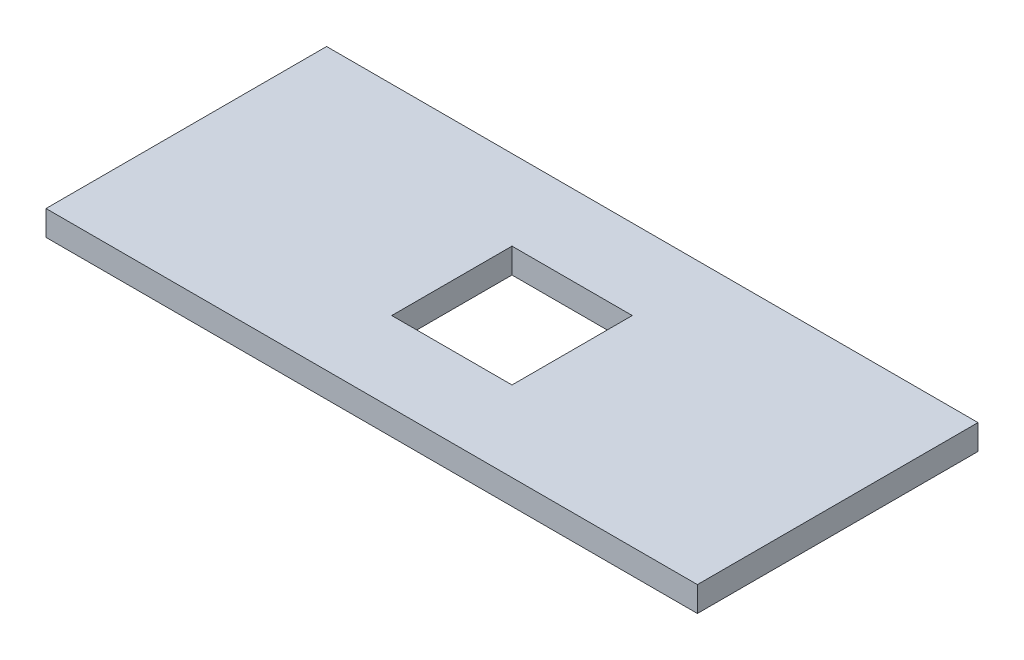
ISO-10303-21;
HEADER;
FILE_DESCRIPTION(('STEP AP214'),'2;1');
FILE_NAME('part.step','',(''),(''),'','','');
FILE_SCHEMA(('AUTOMOTIVE_DESIGN { 1 0 10303 214 1 1 1 1 }'));
ENDSEC;
DATA;
#1=APPLICATION_CONTEXT('core data for automotive mechanical design processes');
#2=APPLICATION_PROTOCOL_DEFINITION('international standard','automotive_design',2000,#1);
#3=PRODUCT_CONTEXT('',#1,'mechanical');
#4=PRODUCT('Part','Part','',(#3));
#5=PRODUCT_RELATED_PRODUCT_CATEGORY('part','',(#4));
#6=PRODUCT_DEFINITION_FORMATION('','',#4);
#7=PRODUCT_DEFINITION_CONTEXT('part definition',#1,'design');
#8=PRODUCT_DEFINITION('design','',#6,#7);
#9=PRODUCT_DEFINITION_SHAPE('','',#8);
#10=(LENGTH_UNIT() NAMED_UNIT(*) SI_UNIT(.MILLI.,.METRE.));
#11=(NAMED_UNIT(*) PLANE_ANGLE_UNIT() SI_UNIT($,.RADIAN.));
#12=(NAMED_UNIT(*) SI_UNIT($,.STERADIAN.) SOLID_ANGLE_UNIT());
#13=UNCERTAINTY_MEASURE_WITH_UNIT(LENGTH_MEASURE(1.E-05),#10,'distance_accuracy_value','');
#14=(GEOMETRIC_REPRESENTATION_CONTEXT(3) GLOBAL_UNCERTAINTY_ASSIGNED_CONTEXT((#13)) GLOBAL_UNIT_ASSIGNED_CONTEXT((#10,
#11,#12)) REPRESENTATION_CONTEXT('',''));
#15=CARTESIAN_POINT('',(0.,0.,0.));
#16=DIRECTION('',(0.,0.,1.));
#17=DIRECTION('',(1.,0.,0.));
#18=AXIS2_PLACEMENT_3D('',#15,#16,#17);
#19=CARTESIAN_POINT('',(0.,5.,0.));
#20=DIRECTION('',(0.,-1.,0.));
#21=DIRECTION('',(0.,0.,-1.));
#22=AXIS2_PLACEMENT_3D('',#19,#20,#21);
#23=PLANE('',#22);
#24=DIRECTION('',(0.,0.,-1.));
#25=VECTOR('',#24,1.);
#26=CARTESIAN_POINT('',(65.,5.,28.));
#27=LINE('',#26,#25);
#28=CARTESIAN_POINT('',(65.,5.,28.));
#29=VERTEX_POINT('',#28);
#30=CARTESIAN_POINT('',(65.,5.,-28.));
#31=VERTEX_POINT('',#30);
#32=EDGE_CURVE('E134',#29,#31,#27,.T.);
#33=ORIENTED_EDGE('',*,*,#32,.T.);
#34=DIRECTION('',(-1.,0.,0.));
#35=VECTOR('',#34,1.);
#36=CARTESIAN_POINT('',(-65.,5.,-28.));
#37=LINE('',#36,#35);
#38=CARTESIAN_POINT('',(-65.,5.,-28.));
#39=VERTEX_POINT('',#38);
#40=EDGE_CURVE('E137',#31,#39,#37,.T.);
#41=ORIENTED_EDGE('',*,*,#40,.T.);
#42=DIRECTION('',(0.,0.,1.));
#43=VECTOR('',#42,1.);
#44=CARTESIAN_POINT('',(-65.,5.,28.));
#45=LINE('',#44,#43);
#46=CARTESIAN_POINT('',(-65.,5.,28.));
#47=VERTEX_POINT('',#46);
#48=EDGE_CURVE('E140',#39,#47,#45,.T.);
#49=ORIENTED_EDGE('',*,*,#48,.T.);
#50=DIRECTION('',(1.,0.,0.));
#51=VECTOR('',#50,1.);
#52=CARTESIAN_POINT('',(-65.,5.,28.));
#53=LINE('',#52,#51);
#54=EDGE_CURVE('E142',#47,#29,#53,.T.);
#55=ORIENTED_EDGE('',*,*,#54,.T.);
#56=EDGE_LOOP('',(#33,#41,#49,#55));
#57=FACE_BOUND('',#56,.T.);
#58=DIRECTION('',(0.,0.,-1.));
#59=VECTOR('',#58,1.);
#60=CARTESIAN_POINT('',(12.,5.,12.));
#61=LINE('',#60,#59);
#62=CARTESIAN_POINT('',(12.,5.,12.));
#63=VERTEX_POINT('',#62);
#64=CARTESIAN_POINT('',(12.,5.,-12.));
#65=VERTEX_POINT('',#64);
#66=EDGE_CURVE('E98',#63,#65,#61,.T.);
#67=ORIENTED_EDGE('',*,*,#66,.F.);
#68=DIRECTION('',(1.,0.,0.));
#69=VECTOR('',#68,1.);
#70=CARTESIAN_POINT('',(-12.,5.,12.));
#71=LINE('',#70,#69);
#72=CARTESIAN_POINT('',(-12.,5.,12.));
#73=VERTEX_POINT('',#72);
#74=EDGE_CURVE('E120',#73,#63,#71,.T.);
#75=ORIENTED_EDGE('',*,*,#74,.F.);
#76=DIRECTION('',(0.,0.,1.));
#77=VECTOR('',#76,1.);
#78=CARTESIAN_POINT('',(-12.,5.,12.));
#79=LINE('',#78,#77);
#80=CARTESIAN_POINT('',(-12.,5.,-12.));
#81=VERTEX_POINT('',#80);
#82=EDGE_CURVE('E118',#81,#73,#79,.T.);
#83=ORIENTED_EDGE('',*,*,#82,.F.);
#84=DIRECTION('',(-1.,0.,0.));
#85=VECTOR('',#84,1.);
#86=CARTESIAN_POINT('',(-12.,5.,-12.));
#87=LINE('',#86,#85);
#88=EDGE_CURVE('E106',#65,#81,#87,.T.);
#89=ORIENTED_EDGE('',*,*,#88,.F.);
#90=EDGE_LOOP('',(#67,#75,#83,#89));
#91=FACE_BOUND('',#90,.T.);
#92=ADVANCED_FACE('F33',(#57,#91),#23,.F.);
#93=CARTESIAN_POINT('',(0.,0.,0.));
#94=DIRECTION('',(0.,-1.,0.));
#95=DIRECTION('',(0.,0.,-1.));
#96=AXIS2_PLACEMENT_3D('',#93,#94,#95);
#97=PLANE('',#96);
#98=DIRECTION('',(0.,0.,-1.));
#99=VECTOR('',#98,1.);
#100=CARTESIAN_POINT('',(65.,0.,28.));
#101=LINE('',#100,#99);
#102=CARTESIAN_POINT('',(65.,0.,28.));
#103=VERTEX_POINT('',#102);
#104=CARTESIAN_POINT('',(65.,0.,-28.));
#105=VERTEX_POINT('',#104);
#106=EDGE_CURVE('E114',#103,#105,#101,.T.);
#107=ORIENTED_EDGE('',*,*,#106,.F.);
#108=DIRECTION('',(1.,0.,0.));
#109=VECTOR('',#108,1.);
#110=CARTESIAN_POINT('',(-65.,0.,28.));
#111=LINE('',#110,#109);
#112=CARTESIAN_POINT('',(-65.,0.,28.));
#113=VERTEX_POINT('',#112);
#114=EDGE_CURVE('E138',#113,#103,#111,.T.);
#115=ORIENTED_EDGE('',*,*,#114,.F.);
#116=DIRECTION('',(0.,0.,1.));
#117=VECTOR('',#116,1.);
#118=CARTESIAN_POINT('',(-65.,0.,28.));
#119=LINE('',#118,#117);
#120=CARTESIAN_POINT('',(-65.,0.,-28.));
#121=VERTEX_POINT('',#120);
#122=EDGE_CURVE('E149',#121,#113,#119,.T.);
#123=ORIENTED_EDGE('',*,*,#122,.F.);
#124=DIRECTION('',(-1.,0.,0.));
#125=VECTOR('',#124,1.);
#126=CARTESIAN_POINT('',(-65.,0.,-28.));
#127=LINE('',#126,#125);
#128=EDGE_CURVE('E147',#105,#121,#127,.T.);
#129=ORIENTED_EDGE('',*,*,#128,.F.);
#130=EDGE_LOOP('',(#107,#115,#123,#129));
#131=FACE_BOUND('',#130,.T.);
#132=DIRECTION('',(1.,0.,0.));
#133=VECTOR('',#132,1.);
#134=CARTESIAN_POINT('',(-12.,0.,12.));
#135=LINE('',#134,#133);
#136=CARTESIAN_POINT('',(-12.,0.,12.));
#137=VERTEX_POINT('',#136);
#138=CARTESIAN_POINT('',(12.,0.,12.));
#139=VERTEX_POINT('',#138);
#140=EDGE_CURVE('E107',#137,#139,#135,.T.);
#141=ORIENTED_EDGE('',*,*,#140,.T.);
#142=DIRECTION('',(0.,0.,-1.));
#143=VECTOR('',#142,1.);
#144=CARTESIAN_POINT('',(12.,0.,12.));
#145=LINE('',#144,#143);
#146=CARTESIAN_POINT('',(12.,0.,-12.));
#147=VERTEX_POINT('',#146);
#148=EDGE_CURVE('E56',#139,#147,#145,.T.);
#149=ORIENTED_EDGE('',*,*,#148,.T.);
#150=DIRECTION('',(-1.,0.,0.));
#151=VECTOR('',#150,1.);
#152=CARTESIAN_POINT('',(-12.,0.,-12.));
#153=LINE('',#152,#151);
#154=CARTESIAN_POINT('',(-12.,0.,-12.));
#155=VERTEX_POINT('',#154);
#156=EDGE_CURVE('E113',#147,#155,#153,.T.);
#157=ORIENTED_EDGE('',*,*,#156,.T.);
#158=DIRECTION('',(0.,0.,1.));
#159=VECTOR('',#158,1.);
#160=CARTESIAN_POINT('',(-12.,0.,12.));
#161=LINE('',#160,#159);
#162=EDGE_CURVE('E126',#155,#137,#161,.T.);
#163=ORIENTED_EDGE('',*,*,#162,.T.);
#164=EDGE_LOOP('',(#141,#149,#157,#163));
#165=FACE_BOUND('',#164,.T.);
#166=ADVANCED_FACE('F167',(#131,#165),#97,.T.);
#167=CARTESIAN_POINT('',(65.,5.,28.));
#168=DIRECTION('',(-1.,0.,0.));
#169=DIRECTION('',(0.,0.,1.));
#170=AXIS2_PLACEMENT_3D('',#167,#168,#169);
#171=PLANE('',#170);
#172=ORIENTED_EDGE('',*,*,#106,.T.);
#173=DIRECTION('',(0.,-1.,0.));
#174=VECTOR('',#173,1.);
#175=CARTESIAN_POINT('',(65.,5.,-28.));
#176=LINE('',#175,#174);
#177=EDGE_CURVE('E11',#31,#105,#176,.T.);
#178=ORIENTED_EDGE('',*,*,#177,.F.);
#179=ORIENTED_EDGE('',*,*,#32,.F.);
#180=DIRECTION('',(0.,-1.,0.));
#181=VECTOR('',#180,1.);
#182=CARTESIAN_POINT('',(65.,5.,28.));
#183=LINE('',#182,#181);
#184=EDGE_CURVE('E144',#29,#103,#183,.T.);
#185=ORIENTED_EDGE('',*,*,#184,.T.);
#186=EDGE_LOOP('',(#172,#178,#179,#185));
#187=FACE_BOUND('',#186,.T.);
#188=ADVANCED_FACE('F35',(#187),#171,.F.);
#189=CARTESIAN_POINT('',(-65.,5.,-28.));
#190=DIRECTION('',(0.,0.,1.));
#191=DIRECTION('',(1.,0.,0.));
#192=AXIS2_PLACEMENT_3D('',#189,#190,#191);
#193=PLANE('',#192);
#194=ORIENTED_EDGE('',*,*,#128,.T.);
#195=DIRECTION('',(0.,-1.,0.));
#196=VECTOR('',#195,1.);
#197=CARTESIAN_POINT('',(-65.,5.,-28.));
#198=LINE('',#197,#196);
#199=EDGE_CURVE('E41',#39,#121,#198,.T.);
#200=ORIENTED_EDGE('',*,*,#199,.F.);
#201=ORIENTED_EDGE('',*,*,#40,.F.);
#202=ORIENTED_EDGE('',*,*,#177,.T.);
#203=EDGE_LOOP('',(#194,#200,#201,#202));
#204=FACE_BOUND('',#203,.T.);
#205=ADVANCED_FACE('F177',(#204),#193,.F.);
#206=CARTESIAN_POINT('',(-65.,5.,28.));
#207=DIRECTION('',(1.,0.,0.));
#208=DIRECTION('',(0.,0.,-1.));
#209=AXIS2_PLACEMENT_3D('',#206,#207,#208);
#210=PLANE('',#209);
#211=ORIENTED_EDGE('',*,*,#122,.T.);
#212=DIRECTION('',(0.,-1.,0.));
#213=VECTOR('',#212,1.);
#214=CARTESIAN_POINT('',(-65.,5.,28.));
#215=LINE('',#214,#213);
#216=EDGE_CURVE('E154',#47,#113,#215,.T.);
#217=ORIENTED_EDGE('',*,*,#216,.F.);
#218=ORIENTED_EDGE('',*,*,#48,.F.);
#219=ORIENTED_EDGE('',*,*,#199,.T.);
#220=EDGE_LOOP('',(#211,#217,#218,#219));
#221=FACE_BOUND('',#220,.T.);
#222=ADVANCED_FACE('F161',(#221),#210,.F.);
#223=CARTESIAN_POINT('',(-65.,5.,28.));
#224=DIRECTION('',(0.,0.,-1.));
#225=DIRECTION('',(-1.,0.,0.));
#226=AXIS2_PLACEMENT_3D('',#223,#224,#225);
#227=PLANE('',#226);
#228=ORIENTED_EDGE('',*,*,#114,.T.);
#229=ORIENTED_EDGE('',*,*,#184,.F.);
#230=ORIENTED_EDGE('',*,*,#54,.F.);
#231=ORIENTED_EDGE('',*,*,#216,.T.);
#232=EDGE_LOOP('',(#228,#229,#230,#231));
#233=FACE_BOUND('',#232,.T.);
#234=ADVANCED_FACE('F171',(#233),#227,.F.);
#235=CARTESIAN_POINT('',(12.,5.,12.));
#236=DIRECTION('',(-1.,0.,0.));
#237=DIRECTION('',(0.,0.,1.));
#238=AXIS2_PLACEMENT_3D('',#235,#236,#237);
#239=PLANE('',#238);
#240=ORIENTED_EDGE('',*,*,#148,.F.);
#241=DIRECTION('',(0.,-1.,0.));
#242=VECTOR('',#241,1.);
#243=CARTESIAN_POINT('',(12.,5.,12.));
#244=LINE('',#243,#242);
#245=EDGE_CURVE('E102',#63,#139,#244,.T.);
#246=ORIENTED_EDGE('',*,*,#245,.F.);
#247=ORIENTED_EDGE('',*,*,#66,.T.);
#248=DIRECTION('',(0.,-1.,0.));
#249=VECTOR('',#248,1.);
#250=CARTESIAN_POINT('',(12.,5.,-12.));
#251=LINE('',#250,#249);
#252=EDGE_CURVE('E101',#65,#147,#251,.T.);
#253=ORIENTED_EDGE('',*,*,#252,.T.);
#254=EDGE_LOOP('',(#240,#246,#247,#253));
#255=FACE_BOUND('',#254,.T.);
#256=ADVANCED_FACE('F100',(#255),#239,.T.);
#257=CARTESIAN_POINT('',(-12.,5.,-12.));
#258=DIRECTION('',(0.,0.,1.));
#259=DIRECTION('',(1.,0.,0.));
#260=AXIS2_PLACEMENT_3D('',#257,#258,#259);
#261=PLANE('',#260);
#262=ORIENTED_EDGE('',*,*,#156,.F.);
#263=ORIENTED_EDGE('',*,*,#252,.F.);
#264=ORIENTED_EDGE('',*,*,#88,.T.);
#265=DIRECTION('',(0.,-1.,0.));
#266=VECTOR('',#265,1.);
#267=CARTESIAN_POINT('',(-12.,5.,-12.));
#268=LINE('',#267,#266);
#269=EDGE_CURVE('E115',#81,#155,#268,.T.);
#270=ORIENTED_EDGE('',*,*,#269,.T.);
#271=EDGE_LOOP('',(#262,#263,#264,#270));
#272=FACE_BOUND('',#271,.T.);
#273=ADVANCED_FACE('F110',(#272),#261,.T.);
#274=CARTESIAN_POINT('',(-12.,5.,12.));
#275=DIRECTION('',(1.,0.,0.));
#276=DIRECTION('',(0.,0.,-1.));
#277=AXIS2_PLACEMENT_3D('',#274,#275,#276);
#278=PLANE('',#277);
#279=ORIENTED_EDGE('',*,*,#162,.F.);
#280=ORIENTED_EDGE('',*,*,#269,.F.);
#281=ORIENTED_EDGE('',*,*,#82,.T.);
#282=DIRECTION('',(0.,-1.,0.));
#283=VECTOR('',#282,1.);
#284=CARTESIAN_POINT('',(-12.,5.,12.));
#285=LINE('',#284,#283);
#286=EDGE_CURVE('E48',#73,#137,#285,.T.);
#287=ORIENTED_EDGE('',*,*,#286,.T.);
#288=EDGE_LOOP('',(#279,#280,#281,#287));
#289=FACE_BOUND('',#288,.T.);
#290=ADVANCED_FACE('F200',(#289),#278,.T.);
#291=CARTESIAN_POINT('',(-12.,5.,12.));
#292=DIRECTION('',(0.,0.,-1.));
#293=DIRECTION('',(-1.,0.,0.));
#294=AXIS2_PLACEMENT_3D('',#291,#292,#293);
#295=PLANE('',#294);
#296=ORIENTED_EDGE('',*,*,#140,.F.);
#297=ORIENTED_EDGE('',*,*,#286,.F.);
#298=ORIENTED_EDGE('',*,*,#74,.T.);
#299=ORIENTED_EDGE('',*,*,#245,.T.);
#300=EDGE_LOOP('',(#296,#297,#298,#299));
#301=FACE_BOUND('',#300,.T.);
#302=ADVANCED_FACE('F204',(#301),#295,.T.);
#303=CLOSED_SHELL('',(#92,#166,#188,#205,#222,#234,#256,#273,#290,#302));
#304=MANIFOLD_SOLID_BREP('B2',#303);
#305=ADVANCED_BREP_SHAPE_REPRESENTATION('',(#18,#304),#14);
#306=SHAPE_DEFINITION_REPRESENTATION(#9,#305);
ENDSEC;
END-ISO-10303-21;
